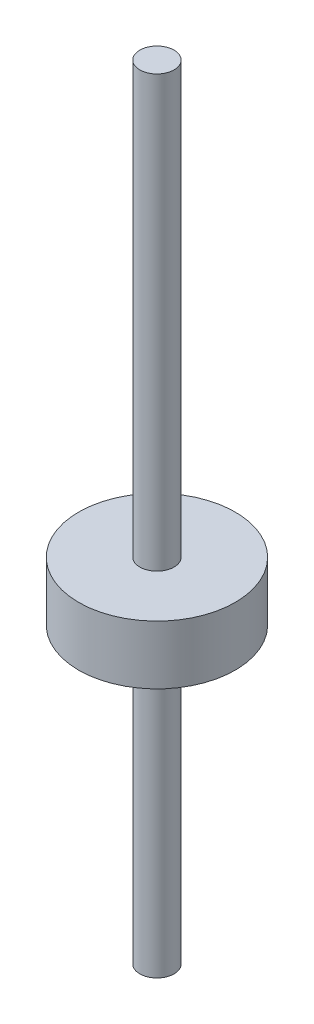
ISO-10303-21;
HEADER;
FILE_DESCRIPTION(('STEP AP214'),'2;1');
FILE_NAME('part.step','',(''),(''),'','','');
FILE_SCHEMA(('AUTOMOTIVE_DESIGN { 1 0 10303 214 1 1 1 1 }'));
ENDSEC;
DATA;
#1=APPLICATION_CONTEXT('core data for automotive mechanical design processes');
#2=APPLICATION_PROTOCOL_DEFINITION('international standard','automotive_design',2000,#1);
#3=PRODUCT_CONTEXT('',#1,'mechanical');
#4=PRODUCT('Part','Part','',(#3));
#5=PRODUCT_RELATED_PRODUCT_CATEGORY('part','',(#4));
#6=PRODUCT_DEFINITION_FORMATION('','',#4);
#7=PRODUCT_DEFINITION_CONTEXT('part definition',#1,'design');
#8=PRODUCT_DEFINITION('design','',#6,#7);
#9=PRODUCT_DEFINITION_SHAPE('','',#8);
#10=(LENGTH_UNIT() NAMED_UNIT(*) SI_UNIT(.MILLI.,.METRE.));
#11=(NAMED_UNIT(*) PLANE_ANGLE_UNIT() SI_UNIT($,.RADIAN.));
#12=(NAMED_UNIT(*) SI_UNIT($,.STERADIAN.) SOLID_ANGLE_UNIT());
#13=UNCERTAINTY_MEASURE_WITH_UNIT(LENGTH_MEASURE(1.E-05),#10,'distance_accuracy_value','');
#14=(GEOMETRIC_REPRESENTATION_CONTEXT(3) GLOBAL_UNCERTAINTY_ASSIGNED_CONTEXT((#13)) GLOBAL_UNIT_ASSIGNED_CONTEXT((#10,
#11,#12)) REPRESENTATION_CONTEXT('',''));
#15=CARTESIAN_POINT('',(0.,0.,0.));
#16=DIRECTION('',(0.,0.,1.));
#17=DIRECTION('',(1.,0.,0.));
#18=AXIS2_PLACEMENT_3D('',#15,#16,#17);
#19=CARTESIAN_POINT('',(0.,18.,0.));
#20=DIRECTION('',(0.,-1.,0.));
#21=DIRECTION('',(0.,0.,-1.));
#22=AXIS2_PLACEMENT_3D('',#19,#20,#21);
#23=CYLINDRICAL_SURFACE('',#22,0.875);
#24=CARTESIAN_POINT('',(0.,0.,0.));
#25=DIRECTION('',(0.,1.,0.));
#26=DIRECTION('',(0.,0.,1.));
#27=AXIS2_PLACEMENT_3D('',#24,#25,#26);
#28=CIRCLE('',#27,0.875);
#29=CARTESIAN_POINT('',(0.,0.,0.875));
#30=VERTEX_POINT('',#29);
#31=EDGE_CURVE('E56',#30,#30,#28,.T.);
#32=ORIENTED_EDGE('',*,*,#31,.T.);
#33=EDGE_LOOP('',(#32));
#34=FACE_BOUND('',#33,.T.);
#35=CARTESIAN_POINT('',(0.,15.,0.));
#36=DIRECTION('',(0.,1.,0.));
#37=DIRECTION('',(0.,0.,1.));
#38=AXIS2_PLACEMENT_3D('',#35,#36,#37);
#39=CIRCLE('',#38,0.875);
#40=CARTESIAN_POINT('',(0.,15.,0.875));
#41=VERTEX_POINT('',#40);
#42=EDGE_CURVE('E46',#41,#41,#39,.T.);
#43=ORIENTED_EDGE('',*,*,#42,.F.);
#44=EDGE_LOOP('',(#43));
#45=FACE_BOUND('',#44,.T.);
#46=ADVANCED_FACE('F43',(#34,#45),#23,.T.);
#47=CARTESIAN_POINT('',(0.,0.,0.));
#48=DIRECTION('',(0.,1.,0.));
#49=DIRECTION('',(0.,0.,1.));
#50=AXIS2_PLACEMENT_3D('',#47,#48,#49);
#51=PLANE('',#50);
#52=ORIENTED_EDGE('',*,*,#31,.F.);
#53=EDGE_LOOP('',(#52));
#54=FACE_BOUND('',#53,.T.);
#55=ADVANCED_FACE('F73',(#54),#51,.F.);
#56=CARTESIAN_POINT('',(0.,15.,0.));
#57=DIRECTION('',(0.,1.,0.));
#58=DIRECTION('',(0.,0.,1.));
#59=AXIS2_PLACEMENT_3D('',#56,#57,#58);
#60=CYLINDRICAL_SURFACE('',#59,4.);
#61=CARTESIAN_POINT('',(0.,15.,0.));
#62=DIRECTION('',(0.,1.,0.));
#63=DIRECTION('',(0.,0.,1.));
#64=AXIS2_PLACEMENT_3D('',#61,#62,#63);
#65=CIRCLE('',#64,4.);
#66=CARTESIAN_POINT('',(0.,15.,4.));
#67=VERTEX_POINT('',#66);
#68=EDGE_CURVE('E60',#67,#67,#65,.T.);
#69=ORIENTED_EDGE('',*,*,#68,.T.);
#70=EDGE_LOOP('',(#69));
#71=FACE_BOUND('',#70,.T.);
#72=CARTESIAN_POINT('',(0.,18.,0.));
#73=DIRECTION('',(0.,1.,0.));
#74=DIRECTION('',(0.,0.,1.));
#75=AXIS2_PLACEMENT_3D('',#72,#73,#74);
#76=CIRCLE('',#75,4.);
#77=CARTESIAN_POINT('',(0.,18.,4.));
#78=VERTEX_POINT('',#77);
#79=EDGE_CURVE('E64',#78,#78,#76,.T.);
#80=ORIENTED_EDGE('',*,*,#79,.F.);
#81=EDGE_LOOP('',(#80));
#82=FACE_BOUND('',#81,.T.);
#83=ADVANCED_FACE('F75',(#71,#82),#60,.T.);
#84=CARTESIAN_POINT('',(0.,15.,0.));
#85=DIRECTION('',(0.,1.,0.));
#86=DIRECTION('',(0.,0.,1.));
#87=AXIS2_PLACEMENT_3D('',#84,#85,#86);
#88=PLANE('',#87);
#89=ORIENTED_EDGE('',*,*,#42,.T.);
#90=EDGE_LOOP('',(#89));
#91=FACE_BOUND('',#90,.T.);
#92=ORIENTED_EDGE('',*,*,#68,.F.);
#93=EDGE_LOOP('',(#92));
#94=FACE_BOUND('',#93,.T.);
#95=ADVANCED_FACE('F80',(#91,#94),#88,.F.);
#96=CARTESIAN_POINT('',(0.,18.,0.));
#97=DIRECTION('',(0.,1.,0.));
#98=DIRECTION('',(0.,0.,1.));
#99=AXIS2_PLACEMENT_3D('',#96,#97,#98);
#100=PLANE('',#99);
#101=CARTESIAN_POINT('',(0.,18.,0.));
#102=DIRECTION('',(0.,1.,0.));
#103=DIRECTION('',(0.,0.,1.));
#104=AXIS2_PLACEMENT_3D('',#101,#102,#103);
#105=CIRCLE('',#104,0.875);
#106=CARTESIAN_POINT('',(0.,18.,0.875));
#107=VERTEX_POINT('',#106);
#108=EDGE_CURVE('E10',#107,#107,#105,.T.);
#109=ORIENTED_EDGE('',*,*,#108,.F.);
#110=EDGE_LOOP('',(#109));
#111=FACE_BOUND('',#110,.T.);
#112=ORIENTED_EDGE('',*,*,#79,.T.);
#113=EDGE_LOOP('',(#112));
#114=FACE_BOUND('',#113,.T.);
#115=ADVANCED_FACE('F84',(#111,#114),#100,.T.);
#116=CARTESIAN_POINT('',(0.,40.,0.));
#117=DIRECTION('',(0.,-1.,0.));
#118=DIRECTION('',(0.,0.,-1.));
#119=AXIS2_PLACEMENT_3D('',#116,#117,#118);
#120=CYLINDRICAL_SURFACE('',#119,0.875);
#121=CARTESIAN_POINT('',(0.,40.,0.));
#122=DIRECTION('',(0.,1.,0.));
#123=DIRECTION('',(0.,0.,1.));
#124=AXIS2_PLACEMENT_3D('',#121,#122,#123);
#125=CIRCLE('',#124,0.875);
#126=CARTESIAN_POINT('',(0.,40.,0.875));
#127=VERTEX_POINT('',#126);
#128=EDGE_CURVE('E59',#127,#127,#125,.T.);
#129=ORIENTED_EDGE('',*,*,#128,.F.);
#130=EDGE_LOOP('',(#129));
#131=FACE_BOUND('',#130,.T.);
#132=ORIENTED_EDGE('',*,*,#108,.T.);
#133=EDGE_LOOP('',(#132));
#134=FACE_BOUND('',#133,.T.);
#135=ADVANCED_FACE('F86',(#131,#134),#120,.T.);
#136=CARTESIAN_POINT('',(0.,40.,0.));
#137=DIRECTION('',(0.,1.,0.));
#138=DIRECTION('',(0.,0.,1.));
#139=AXIS2_PLACEMENT_3D('',#136,#137,#138);
#140=PLANE('',#139);
#141=ORIENTED_EDGE('',*,*,#128,.T.);
#142=EDGE_LOOP('',(#141));
#143=FACE_BOUND('',#142,.T.);
#144=ADVANCED_FACE('F94',(#143),#140,.T.);
#145=CLOSED_SHELL('',(#46,#55,#83,#95,#115,#135,#144));
#146=MANIFOLD_SOLID_BREP('B2',#145);
#147=ADVANCED_BREP_SHAPE_REPRESENTATION('',(#18,#146),#14);
#148=SHAPE_DEFINITION_REPRESENTATION(#9,#147);
ENDSEC;
END-ISO-10303-21;
